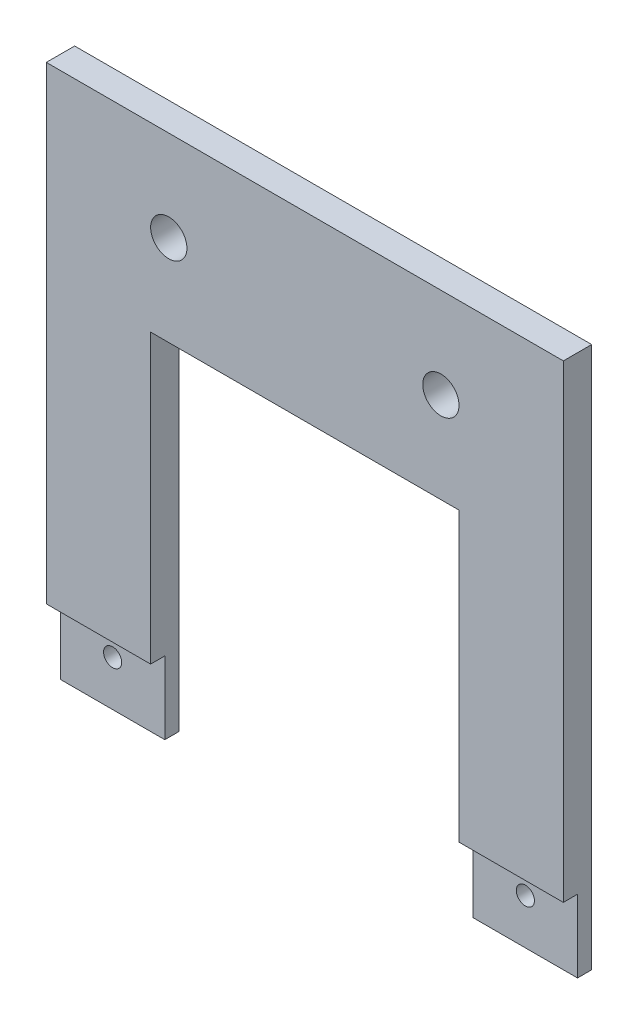
ISO-10303-21;
HEADER;
FILE_DESCRIPTION(('STEP AP214'),'2;1');
FILE_NAME('part.step','',(''),(''),'','','');
FILE_SCHEMA(('AUTOMOTIVE_DESIGN { 1 0 10303 214 1 1 1 1 }'));
ENDSEC;
DATA;
#1=APPLICATION_CONTEXT('core data for automotive mechanical design processes');
#2=APPLICATION_PROTOCOL_DEFINITION('international standard','automotive_design',2000,#1);
#3=PRODUCT_CONTEXT('',#1,'mechanical');
#4=PRODUCT('Part','Part','',(#3));
#5=PRODUCT_RELATED_PRODUCT_CATEGORY('part','',(#4));
#6=PRODUCT_DEFINITION_FORMATION('','',#4);
#7=PRODUCT_DEFINITION_CONTEXT('part definition',#1,'design');
#8=PRODUCT_DEFINITION('design','',#6,#7);
#9=PRODUCT_DEFINITION_SHAPE('','',#8);
#10=(LENGTH_UNIT() NAMED_UNIT(*) SI_UNIT(.MILLI.,.METRE.));
#11=(NAMED_UNIT(*) PLANE_ANGLE_UNIT() SI_UNIT($,.RADIAN.));
#12=(NAMED_UNIT(*) SI_UNIT($,.STERADIAN.) SOLID_ANGLE_UNIT());
#13=UNCERTAINTY_MEASURE_WITH_UNIT(LENGTH_MEASURE(1.E-05),#10,'distance_accuracy_value','');
#14=(GEOMETRIC_REPRESENTATION_CONTEXT(3) GLOBAL_UNCERTAINTY_ASSIGNED_CONTEXT((#13)) GLOBAL_UNIT_ASSIGNED_CONTEXT((#10,
#11,#12)) REPRESENTATION_CONTEXT('',''));
#15=CARTESIAN_POINT('',(0.,0.,0.));
#16=DIRECTION('',(0.,0.,1.));
#17=DIRECTION('',(1.,0.,0.));
#18=AXIS2_PLACEMENT_3D('',#15,#16,#17);
#19=CARTESIAN_POINT('',(0.,-19.85,0.781250025));
#20=DIRECTION('',(0.,-1.,0.));
#21=DIRECTION('',(1.,0.,0.));
#22=AXIS2_PLACEMENT_3D('',#19,#20,#21);
#23=PLANE('',#22);
#24=DIRECTION('',(0.,0.,-1.));
#25=VECTOR('',#24,1.);
#26=CARTESIAN_POINT('',(14.25,-19.85,0.781250025));
#27=LINE('',#26,#25);
#28=CARTESIAN_POINT('',(14.25,-19.85,0.));
#29=VERTEX_POINT('',#28);
#30=CARTESIAN_POINT('',(14.25,-19.85,-0.781250025));
#31=VERTEX_POINT('',#30);
#32=EDGE_CURVE('E43',#29,#31,#27,.T.);
#33=ORIENTED_EDGE('',*,*,#32,.F.);
#34=DIRECTION('',(1.,0.,0.));
#35=VECTOR('',#34,1.);
#36=CARTESIAN_POINT('',(0.,-19.85,0.));
#37=LINE('',#36,#35);
#38=CARTESIAN_POINT('',(8.49999999999999,-19.85,0.));
#39=VERTEX_POINT('',#38);
#40=EDGE_CURVE('E167',#39,#29,#37,.T.);
#41=ORIENTED_EDGE('',*,*,#40,.F.);
#42=DIRECTION('',(0.,0.,-1.));
#43=VECTOR('',#42,1.);
#44=CARTESIAN_POINT('',(8.49999999999999,-19.85,0.781250025));
#45=LINE('',#44,#43);
#46=CARTESIAN_POINT('',(8.49999999999999,-19.85,-0.781250025));
#47=VERTEX_POINT('',#46);
#48=EDGE_CURVE('E11',#39,#47,#45,.T.);
#49=ORIENTED_EDGE('',*,*,#48,.T.);
#50=DIRECTION('',(-1.,0.,0.));
#51=VECTOR('',#50,1.);
#52=CARTESIAN_POINT('',(0.,-19.85,-0.781250025));
#53=LINE('',#52,#51);
#54=EDGE_CURVE('E203',#31,#47,#53,.T.);
#55=ORIENTED_EDGE('',*,*,#54,.F.);
#56=EDGE_LOOP('',(#33,#41,#49,#55));
#57=FACE_BOUND('',#56,.T.);
#58=ADVANCED_FACE('F35',(#57),#23,.T.);
#59=CARTESIAN_POINT('',(-14.25,0.,0.781250025));
#60=DIRECTION('',(-1.,0.,0.));
#61=DIRECTION('',(0.,0.,1.));
#62=AXIS2_PLACEMENT_3D('',#59,#60,#61);
#63=PLANE('',#62);
#64=DIRECTION('',(0.,-1.,0.));
#65=VECTOR('',#64,1.);
#66=CARTESIAN_POINT('',(-14.25,0.,0.));
#67=LINE('',#66,#65);
#68=CARTESIAN_POINT('',(-14.25,-15.85,0.));
#69=VERTEX_POINT('',#68);
#70=CARTESIAN_POINT('',(-14.25,-19.85,0.));
#71=VERTEX_POINT('',#70);
#72=EDGE_CURVE('E135',#69,#71,#67,.T.);
#73=ORIENTED_EDGE('',*,*,#72,.F.);
#74=DIRECTION('',(0.,0.,1.));
#75=VECTOR('',#74,1.);
#76=CARTESIAN_POINT('',(-14.25,-15.85,0.));
#77=LINE('',#76,#75);
#78=CARTESIAN_POINT('',(-14.25,-15.85,0.781250025));
#79=VERTEX_POINT('',#78);
#80=EDGE_CURVE('E121',#69,#79,#77,.T.);
#81=ORIENTED_EDGE('',*,*,#80,.T.);
#82=DIRECTION('',(0.,1.,0.));
#83=VECTOR('',#82,1.);
#84=CARTESIAN_POINT('',(-14.25,0.,0.781250025));
#85=LINE('',#84,#83);
#86=CARTESIAN_POINT('',(-14.25,10.,0.781250025));
#87=VERTEX_POINT('',#86);
#88=EDGE_CURVE('E187',#79,#87,#85,.T.);
#89=ORIENTED_EDGE('',*,*,#88,.T.);
#90=DIRECTION('',(0.,0.,-1.));
#91=VECTOR('',#90,1.);
#92=CARTESIAN_POINT('',(-14.25,10.,0.781250025));
#93=LINE('',#92,#91);
#94=CARTESIAN_POINT('',(-14.25,10.,-0.781250025));
#95=VERTEX_POINT('',#94);
#96=EDGE_CURVE('E236',#87,#95,#93,.T.);
#97=ORIENTED_EDGE('',*,*,#96,.T.);
#98=DIRECTION('',(0.,1.,0.));
#99=VECTOR('',#98,1.);
#100=CARTESIAN_POINT('',(-14.25,0.,-0.781250025));
#101=LINE('',#100,#99);
#102=CARTESIAN_POINT('',(-14.25,-19.85,-0.781250025));
#103=VERTEX_POINT('',#102);
#104=EDGE_CURVE('E212',#103,#95,#101,.T.);
#105=ORIENTED_EDGE('',*,*,#104,.F.);
#106=DIRECTION('',(0.,0.,-1.));
#107=VECTOR('',#106,1.);
#108=CARTESIAN_POINT('',(-14.25,-19.85,0.781250025));
#109=LINE('',#108,#107);
#110=EDGE_CURVE('E143',#71,#103,#109,.T.);
#111=ORIENTED_EDGE('',*,*,#110,.F.);
#112=EDGE_LOOP('',(#73,#81,#89,#97,#105,#111));
#113=FACE_BOUND('',#112,.T.);
#114=ADVANCED_FACE('F141',(#113),#63,.T.);
#115=CARTESIAN_POINT('',(0.,-19.85,0.781250025));
#116=DIRECTION('',(0.,1.,0.));
#117=DIRECTION('',(-1.,0.,0.));
#118=AXIS2_PLACEMENT_3D('',#115,#116,#117);
#119=PLANE('',#118);
#120=DIRECTION('',(1.,0.,0.));
#121=VECTOR('',#120,1.);
#122=CARTESIAN_POINT('',(0.,-19.85,0.));
#123=LINE('',#122,#121);
#124=CARTESIAN_POINT('',(-8.5,-19.85,0.));
#125=VERTEX_POINT('',#124);
#126=EDGE_CURVE('E144',#71,#125,#123,.T.);
#127=ORIENTED_EDGE('',*,*,#126,.F.);
#128=ORIENTED_EDGE('',*,*,#110,.T.);
#129=DIRECTION('',(1.,0.,0.));
#130=VECTOR('',#129,1.);
#131=CARTESIAN_POINT('',(0.,-19.85,-0.781250025));
#132=LINE('',#131,#130);
#133=CARTESIAN_POINT('',(-8.5,-19.85,-0.781250025));
#134=VERTEX_POINT('',#133);
#135=EDGE_CURVE('E215',#103,#134,#132,.T.);
#136=ORIENTED_EDGE('',*,*,#135,.T.);
#137=DIRECTION('',(0.,0.,-1.));
#138=VECTOR('',#137,1.);
#139=CARTESIAN_POINT('',(-8.5,-19.85,0.781250025));
#140=LINE('',#139,#138);
#141=EDGE_CURVE('E233',#125,#134,#140,.T.);
#142=ORIENTED_EDGE('',*,*,#141,.F.);
#143=EDGE_LOOP('',(#127,#128,#136,#142));
#144=FACE_BOUND('',#143,.T.);
#145=ADVANCED_FACE('F270',(#144),#119,.F.);
#146=CARTESIAN_POINT('',(-8.5,0.,0.781250025));
#147=DIRECTION('',(-1.,0.,0.));
#148=DIRECTION('',(0.,0.,1.));
#149=AXIS2_PLACEMENT_3D('',#146,#147,#148);
#150=PLANE('',#149);
#151=DIRECTION('',(0.,0.,1.));
#152=VECTOR('',#151,1.);
#153=CARTESIAN_POINT('',(-8.5,-15.85,0.));
#154=LINE('',#153,#152);
#155=CARTESIAN_POINT('',(-8.5,-15.85,0.));
#156=VERTEX_POINT('',#155);
#157=CARTESIAN_POINT('',(-8.5,-15.85,0.781250025));
#158=VERTEX_POINT('',#157);
#159=EDGE_CURVE('E50',#156,#158,#154,.T.);
#160=ORIENTED_EDGE('',*,*,#159,.F.);
#161=DIRECTION('',(0.,1.,0.));
#162=VECTOR('',#161,1.);
#163=CARTESIAN_POINT('',(-8.5,0.,0.));
#164=LINE('',#163,#162);
#165=EDGE_CURVE('E138',#125,#156,#164,.T.);
#166=ORIENTED_EDGE('',*,*,#165,.F.);
#167=ORIENTED_EDGE('',*,*,#141,.T.);
#168=DIRECTION('',(0.,1.,0.));
#169=VECTOR('',#168,1.);
#170=CARTESIAN_POINT('',(-8.5,0.,-0.781250025));
#171=LINE('',#170,#169);
#172=CARTESIAN_POINT('',(-8.5,0.,-0.781250025));
#173=VERTEX_POINT('',#172);
#174=EDGE_CURVE('E218',#134,#173,#171,.T.);
#175=ORIENTED_EDGE('',*,*,#174,.T.);
#176=DIRECTION('',(0.,0.,-1.));
#177=VECTOR('',#176,1.);
#178=CARTESIAN_POINT('',(-8.5,0.,0.781250025));
#179=LINE('',#178,#177);
#180=CARTESIAN_POINT('',(-8.5,0.,0.781250025));
#181=VERTEX_POINT('',#180);
#182=EDGE_CURVE('E230',#181,#173,#179,.T.);
#183=ORIENTED_EDGE('',*,*,#182,.F.);
#184=DIRECTION('',(0.,1.,0.));
#185=VECTOR('',#184,1.);
#186=CARTESIAN_POINT('',(-8.5,0.,0.781250025));
#187=LINE('',#186,#185);
#188=EDGE_CURVE('E189',#158,#181,#187,.T.);
#189=ORIENTED_EDGE('',*,*,#188,.F.);
#190=EDGE_LOOP('',(#160,#166,#167,#175,#183,#189));
#191=FACE_BOUND('',#190,.T.);
#192=ADVANCED_FACE('F267',(#191),#150,.F.);
#193=CARTESIAN_POINT('',(11.375,-17.35,0.781250025));
#194=DIRECTION('',(0.,0.,-1.));
#195=DIRECTION('',(-1.,0.,0.));
#196=AXIS2_PLACEMENT_3D('',#193,#194,#195);
#197=CYLINDRICAL_SURFACE('',#196,0.500000000000001);
#198=CARTESIAN_POINT('',(11.375,-17.35,-0.781250025));
#199=DIRECTION('',(0.,0.,1.));
#200=DIRECTION('',(1.,0.,0.));
#201=AXIS2_PLACEMENT_3D('',#198,#199,#200);
#202=CIRCLE('',#201,0.500000000000001);
#203=CARTESIAN_POINT('',(11.875,-17.35,-0.781250025));
#204=VERTEX_POINT('',#203);
#205=EDGE_CURVE('E224',#204,#204,#202,.F.);
#206=ORIENTED_EDGE('',*,*,#205,.T.);
#207=EDGE_LOOP('',(#206));
#208=FACE_BOUND('',#207,.T.);
#209=CARTESIAN_POINT('',(11.375,-17.35,0.));
#210=DIRECTION('',(0.,0.,1.));
#211=DIRECTION('',(1.,0.,0.));
#212=AXIS2_PLACEMENT_3D('',#209,#210,#211);
#213=CIRCLE('',#212,0.500000000000001);
#214=CARTESIAN_POINT('',(11.875,-17.35,0.));
#215=VERTEX_POINT('',#214);
#216=EDGE_CURVE('E155',#215,#215,#213,.F.);
#217=ORIENTED_EDGE('',*,*,#216,.F.);
#218=EDGE_LOOP('',(#217));
#219=FACE_BOUND('',#218,.T.);
#220=ADVANCED_FACE('F323',(#208,#219),#197,.F.);
#221=CARTESIAN_POINT('',(-11.375,-17.35,0.781250025));
#222=DIRECTION('',(0.,0.,-1.));
#223=DIRECTION('',(-1.,0.,0.));
#224=AXIS2_PLACEMENT_3D('',#221,#222,#223);
#225=CYLINDRICAL_SURFACE('',#224,0.500000000000001);
#226=CARTESIAN_POINT('',(-11.375,-17.35,-0.781250025));
#227=DIRECTION('',(0.,0.,1.));
#228=DIRECTION('',(1.,0.,0.));
#229=AXIS2_PLACEMENT_3D('',#226,#227,#228);
#230=CIRCLE('',#229,0.500000000000001);
#231=CARTESIAN_POINT('',(-10.875,-17.35,-0.781250025));
#232=VERTEX_POINT('',#231);
#233=EDGE_CURVE('E177',#232,#232,#230,.T.);
#234=ORIENTED_EDGE('',*,*,#233,.F.);
#235=EDGE_LOOP('',(#234));
#236=FACE_BOUND('',#235,.T.);
#237=CARTESIAN_POINT('',(-11.375,-17.35,0.));
#238=DIRECTION('',(0.,0.,1.));
#239=DIRECTION('',(1.,0.,0.));
#240=AXIS2_PLACEMENT_3D('',#237,#238,#239);
#241=CIRCLE('',#240,0.500000000000001);
#242=CARTESIAN_POINT('',(-10.875,-17.35,0.));
#243=VERTEX_POINT('',#242);
#244=EDGE_CURVE('E130',#243,#243,#241,.F.);
#245=ORIENTED_EDGE('',*,*,#244,.F.);
#246=EDGE_LOOP('',(#245));
#247=FACE_BOUND('',#246,.T.);
#248=ADVANCED_FACE('F320',(#236,#247),#225,.F.);
#249=CARTESIAN_POINT('',(0.,0.,0.781250025));
#250=DIRECTION('',(0.,0.,1.));
#251=DIRECTION('',(1.,0.,0.));
#252=AXIS2_PLACEMENT_3D('',#249,#250,#251);
#253=PLANE('',#252);
#254=CARTESIAN_POINT('',(7.50000000000001,5.00000000000001,0.781250025));
#255=DIRECTION('',(0.,0.,1.));
#256=DIRECTION('',(1.,0.,0.));
#257=AXIS2_PLACEMENT_3D('',#254,#255,#256);
#258=CIRCLE('',#257,1.);
#259=CARTESIAN_POINT('',(8.50000000000001,5.00000000000001,0.781250025));
#260=VERTEX_POINT('',#259);
#261=EDGE_CURVE('E176',#260,#260,#258,.F.);
#262=ORIENTED_EDGE('',*,*,#261,.T.);
#263=EDGE_LOOP('',(#262));
#264=FACE_BOUND('',#263,.T.);
#265=CARTESIAN_POINT('',(-7.50000000000001,5.00000000000001,0.781250025));
#266=DIRECTION('',(0.,0.,1.));
#267=DIRECTION('',(1.,0.,0.));
#268=AXIS2_PLACEMENT_3D('',#265,#266,#267);
#269=CIRCLE('',#268,1.);
#270=CARTESIAN_POINT('',(-6.50000000000001,5.00000000000001,0.781250025));
#271=VERTEX_POINT('',#270);
#272=EDGE_CURVE('E173',#271,#271,#269,.T.);
#273=ORIENTED_EDGE('',*,*,#272,.F.);
#274=EDGE_LOOP('',(#273));
#275=FACE_BOUND('',#274,.T.);
#276=ORIENTED_EDGE('',*,*,#88,.F.);
#277=DIRECTION('',(1.,0.,0.));
#278=VECTOR('',#277,1.);
#279=CARTESIAN_POINT('',(0.,-15.85,0.781250025));
#280=LINE('',#279,#278);
#281=EDGE_CURVE('E126',#79,#158,#280,.T.);
#282=ORIENTED_EDGE('',*,*,#281,.T.);
#283=ORIENTED_EDGE('',*,*,#188,.T.);
#284=DIRECTION('',(1.,0.,0.));
#285=VECTOR('',#284,1.);
#286=CARTESIAN_POINT('',(0.,0.,0.781250025));
#287=LINE('',#286,#285);
#288=CARTESIAN_POINT('',(8.5,0.,0.781250025));
#289=VERTEX_POINT('',#288);
#290=EDGE_CURVE('E191',#181,#289,#287,.T.);
#291=ORIENTED_EDGE('',*,*,#290,.T.);
#292=DIRECTION('',(0.,1.,0.));
#293=VECTOR('',#292,1.);
#294=CARTESIAN_POINT('',(8.5,0.,0.781250025));
#295=LINE('',#294,#293);
#296=CARTESIAN_POINT('',(8.49999999999999,-15.85,0.781250025));
#297=VERTEX_POINT('',#296);
#298=EDGE_CURVE('E180',#297,#289,#295,.T.);
#299=ORIENTED_EDGE('',*,*,#298,.F.);
#300=DIRECTION('',(-1.,0.,0.));
#301=VECTOR('',#300,1.);
#302=CARTESIAN_POINT('',(0.,-15.85,0.781250025));
#303=LINE('',#302,#301);
#304=CARTESIAN_POINT('',(14.25,-15.85,0.781250025));
#305=VERTEX_POINT('',#304);
#306=EDGE_CURVE('E159',#305,#297,#303,.T.);
#307=ORIENTED_EDGE('',*,*,#306,.F.);
#308=DIRECTION('',(0.,1.,0.));
#309=VECTOR('',#308,1.);
#310=CARTESIAN_POINT('',(14.25,0.,0.781250025));
#311=LINE('',#310,#309);
#312=CARTESIAN_POINT('',(14.25,9.99999999999999,0.781250025));
#313=VERTEX_POINT('',#312);
#314=EDGE_CURVE('E182',#305,#313,#311,.T.);
#315=ORIENTED_EDGE('',*,*,#314,.T.);
#316=DIRECTION('',(-1.,0.,0.));
#317=VECTOR('',#316,1.);
#318=CARTESIAN_POINT('',(0.,10.,0.781250025));
#319=LINE('',#318,#317);
#320=EDGE_CURVE('E184',#313,#87,#319,.T.);
#321=ORIENTED_EDGE('',*,*,#320,.T.);
#322=EDGE_LOOP('',(#276,#282,#283,#291,#299,#307,#315,#321));
#323=FACE_BOUND('',#322,.T.);
#324=ADVANCED_FACE('F276',(#264,#275,#323),#253,.T.);
#325=CARTESIAN_POINT('',(8.5,0.,0.781250025));
#326=DIRECTION('',(-1.,0.,0.));
#327=DIRECTION('',(0.,-1.,0.));
#328=AXIS2_PLACEMENT_3D('',#325,#326,#327);
#329=PLANE('',#328);
#330=DIRECTION('',(0.,0.,1.));
#331=VECTOR('',#330,1.);
#332=CARTESIAN_POINT('',(8.49999999999999,-15.85,0.));
#333=LINE('',#332,#331);
#334=CARTESIAN_POINT('',(8.49999999999999,-15.85,0.));
#335=VERTEX_POINT('',#334);
#336=EDGE_CURVE('E152',#335,#297,#333,.T.);
#337=ORIENTED_EDGE('',*,*,#336,.T.);
#338=ORIENTED_EDGE('',*,*,#298,.T.);
#339=DIRECTION('',(0.,0.,-1.));
#340=VECTOR('',#339,1.);
#341=CARTESIAN_POINT('',(8.5,0.,0.781250025));
#342=LINE('',#341,#340);
#343=CARTESIAN_POINT('',(8.5,0.,-0.781250025));
#344=VERTEX_POINT('',#343);
#345=EDGE_CURVE('E194',#289,#344,#342,.T.);
#346=ORIENTED_EDGE('',*,*,#345,.T.);
#347=DIRECTION('',(0.,1.,0.));
#348=VECTOR('',#347,1.);
#349=CARTESIAN_POINT('',(8.5,0.,-0.781250025));
#350=LINE('',#349,#348);
#351=EDGE_CURVE('E200',#47,#344,#350,.T.);
#352=ORIENTED_EDGE('',*,*,#351,.F.);
#353=ORIENTED_EDGE('',*,*,#48,.F.);
#354=DIRECTION('',(0.,-1.,0.));
#355=VECTOR('',#354,1.);
#356=CARTESIAN_POINT('',(8.5,0.,0.));
#357=LINE('',#356,#355);
#358=EDGE_CURVE('E165',#335,#39,#357,.T.);
#359=ORIENTED_EDGE('',*,*,#358,.F.);
#360=EDGE_LOOP('',(#337,#338,#346,#352,#353,#359));
#361=FACE_BOUND('',#360,.T.);
#362=ADVANCED_FACE('F257',(#361),#329,.T.);
#363=CARTESIAN_POINT('',(14.25,0.,0.781250025));
#364=DIRECTION('',(-1.,0.,0.));
#365=DIRECTION('',(0.,-1.,0.));
#366=AXIS2_PLACEMENT_3D('',#363,#364,#365);
#367=PLANE('',#366);
#368=ORIENTED_EDGE('',*,*,#314,.F.);
#369=DIRECTION('',(0.,0.,1.));
#370=VECTOR('',#369,1.);
#371=CARTESIAN_POINT('',(14.25,-15.85,0.));
#372=LINE('',#371,#370);
#373=CARTESIAN_POINT('',(14.25,-15.85,0.));
#374=VERTEX_POINT('',#373);
#375=EDGE_CURVE('E58',#374,#305,#372,.T.);
#376=ORIENTED_EDGE('',*,*,#375,.F.);
#377=DIRECTION('',(0.,1.,0.));
#378=VECTOR('',#377,1.);
#379=CARTESIAN_POINT('',(14.25,0.,0.));
#380=LINE('',#379,#378);
#381=EDGE_CURVE('E158',#29,#374,#380,.T.);
#382=ORIENTED_EDGE('',*,*,#381,.F.);
#383=ORIENTED_EDGE('',*,*,#32,.T.);
#384=DIRECTION('',(0.,1.,0.));
#385=VECTOR('',#384,1.);
#386=CARTESIAN_POINT('',(14.25,0.,-0.781250025));
#387=LINE('',#386,#385);
#388=CARTESIAN_POINT('',(14.25,9.99999999999999,-0.781250025));
#389=VERTEX_POINT('',#388);
#390=EDGE_CURVE('E206',#31,#389,#387,.T.);
#391=ORIENTED_EDGE('',*,*,#390,.T.);
#392=DIRECTION('',(0.,0.,-1.));
#393=VECTOR('',#392,1.);
#394=CARTESIAN_POINT('',(14.25,9.99999999999999,0.781250025));
#395=LINE('',#394,#393);
#396=EDGE_CURVE('E238',#313,#389,#395,.T.);
#397=ORIENTED_EDGE('',*,*,#396,.F.);
#398=EDGE_LOOP('',(#368,#376,#382,#383,#391,#397));
#399=FACE_BOUND('',#398,.T.);
#400=ADVANCED_FACE('F245',(#399),#367,.F.);
#401=CARTESIAN_POINT('',(0.,10.,0.781250025));
#402=DIRECTION('',(0.,-1.,0.));
#403=DIRECTION('',(1.,0.,0.));
#404=AXIS2_PLACEMENT_3D('',#401,#402,#403);
#405=PLANE('',#404);
#406=DIRECTION('',(-1.,0.,0.));
#407=VECTOR('',#406,1.);
#408=CARTESIAN_POINT('',(0.,10.,-0.781250025));
#409=LINE('',#408,#407);
#410=EDGE_CURVE('E209',#389,#95,#409,.T.);
#411=ORIENTED_EDGE('',*,*,#410,.T.);
#412=ORIENTED_EDGE('',*,*,#96,.F.);
#413=ORIENTED_EDGE('',*,*,#320,.F.);
#414=ORIENTED_EDGE('',*,*,#396,.T.);
#415=EDGE_LOOP('',(#411,#412,#413,#414));
#416=FACE_BOUND('',#415,.T.);
#417=ADVANCED_FACE('F274',(#416),#405,.F.);
#418=CARTESIAN_POINT('',(0.,0.,0.781250025));
#419=DIRECTION('',(0.,1.,0.));
#420=DIRECTION('',(0.,0.,1.));
#421=AXIS2_PLACEMENT_3D('',#418,#419,#420);
#422=PLANE('',#421);
#423=DIRECTION('',(1.,0.,0.));
#424=VECTOR('',#423,1.);
#425=CARTESIAN_POINT('',(0.,0.,-0.781250025));
#426=LINE('',#425,#424);
#427=EDGE_CURVE('E221',#173,#344,#426,.T.);
#428=ORIENTED_EDGE('',*,*,#427,.T.);
#429=ORIENTED_EDGE('',*,*,#345,.F.);
#430=ORIENTED_EDGE('',*,*,#290,.F.);
#431=ORIENTED_EDGE('',*,*,#182,.T.);
#432=EDGE_LOOP('',(#428,#429,#430,#431));
#433=FACE_BOUND('',#432,.T.);
#434=ADVANCED_FACE('F264',(#433),#422,.F.);
#435=CARTESIAN_POINT('',(7.50000000000001,5.00000000000001,0.781250025));
#436=DIRECTION('',(0.,0.,-1.));
#437=DIRECTION('',(-1.,0.,0.));
#438=AXIS2_PLACEMENT_3D('',#435,#436,#437);
#439=CYLINDRICAL_SURFACE('',#438,1.);
#440=ORIENTED_EDGE('',*,*,#261,.F.);
#441=EDGE_LOOP('',(#440));
#442=FACE_BOUND('',#441,.T.);
#443=CARTESIAN_POINT('',(7.50000000000001,5.00000000000001,-0.781250025));
#444=DIRECTION('',(0.,0.,1.));
#445=DIRECTION('',(1.,0.,0.));
#446=AXIS2_PLACEMENT_3D('',#443,#444,#445);
#447=CIRCLE('',#446,1.);
#448=CARTESIAN_POINT('',(8.50000000000001,5.00000000000001,-0.781250025));
#449=VERTEX_POINT('',#448);
#450=EDGE_CURVE('E197',#449,#449,#447,.F.);
#451=ORIENTED_EDGE('',*,*,#450,.T.);
#452=EDGE_LOOP('',(#451));
#453=FACE_BOUND('',#452,.T.);
#454=ADVANCED_FACE('F300',(#442,#453),#439,.F.);
#455=CARTESIAN_POINT('',(-7.50000000000001,5.00000000000001,0.781250025));
#456=DIRECTION('',(0.,0.,-1.));
#457=DIRECTION('',(-1.,0.,0.));
#458=AXIS2_PLACEMENT_3D('',#455,#456,#457);
#459=CYLINDRICAL_SURFACE('',#458,1.);
#460=ORIENTED_EDGE('',*,*,#272,.T.);
#461=EDGE_LOOP('',(#460));
#462=FACE_BOUND('',#461,.T.);
#463=CARTESIAN_POINT('',(-7.50000000000001,5.00000000000001,-0.781250025));
#464=DIRECTION('',(0.,0.,1.));
#465=DIRECTION('',(1.,0.,0.));
#466=AXIS2_PLACEMENT_3D('',#463,#464,#465);
#467=CIRCLE('',#466,1.);
#468=CARTESIAN_POINT('',(-6.50000000000001,5.00000000000001,-0.781250025));
#469=VERTEX_POINT('',#468);
#470=EDGE_CURVE('E153',#469,#469,#467,.T.);
#471=ORIENTED_EDGE('',*,*,#470,.F.);
#472=EDGE_LOOP('',(#471));
#473=FACE_BOUND('',#472,.T.);
#474=ADVANCED_FACE('F37',(#462,#473),#459,.F.);
#475=CARTESIAN_POINT('',(0.,0.,-0.781250025));
#476=DIRECTION('',(0.,0.,1.));
#477=DIRECTION('',(1.,0.,0.));
#478=AXIS2_PLACEMENT_3D('',#475,#476,#477);
#479=PLANE('',#478);
#480=ORIENTED_EDGE('',*,*,#470,.T.);
#481=EDGE_LOOP('',(#480));
#482=FACE_BOUND('',#481,.T.);
#483=ORIENTED_EDGE('',*,*,#450,.F.);
#484=EDGE_LOOP('',(#483));
#485=FACE_BOUND('',#484,.T.);
#486=ORIENTED_EDGE('',*,*,#351,.T.);
#487=ORIENTED_EDGE('',*,*,#427,.F.);
#488=ORIENTED_EDGE('',*,*,#174,.F.);
#489=ORIENTED_EDGE('',*,*,#135,.F.);
#490=ORIENTED_EDGE('',*,*,#104,.T.);
#491=ORIENTED_EDGE('',*,*,#410,.F.);
#492=ORIENTED_EDGE('',*,*,#390,.F.);
#493=ORIENTED_EDGE('',*,*,#54,.T.);
#494=EDGE_LOOP('',(#486,#487,#488,#489,#490,#491,#492,#493));
#495=FACE_BOUND('',#494,.T.);
#496=ORIENTED_EDGE('',*,*,#205,.F.);
#497=EDGE_LOOP('',(#496));
#498=FACE_BOUND('',#497,.T.);
#499=ORIENTED_EDGE('',*,*,#233,.T.);
#500=EDGE_LOOP('',(#499));
#501=FACE_BOUND('',#500,.T.);
#502=ADVANCED_FACE('F251',(#482,#485,#495,#498,#501),#479,.F.);
#503=CARTESIAN_POINT('',(0.,-15.85,0.));
#504=DIRECTION('',(0.,1.,0.));
#505=DIRECTION('',(0.,0.,1.));
#506=AXIS2_PLACEMENT_3D('',#503,#504,#505);
#507=PLANE('',#506);
#508=ORIENTED_EDGE('',*,*,#306,.T.);
#509=ORIENTED_EDGE('',*,*,#336,.F.);
#510=DIRECTION('',(-1.,0.,0.));
#511=VECTOR('',#510,1.);
#512=CARTESIAN_POINT('',(0.,-15.85,0.));
#513=LINE('',#512,#511);
#514=EDGE_CURVE('E162',#374,#335,#513,.T.);
#515=ORIENTED_EDGE('',*,*,#514,.F.);
#516=ORIENTED_EDGE('',*,*,#375,.T.);
#517=EDGE_LOOP('',(#508,#509,#515,#516));
#518=FACE_BOUND('',#517,.T.);
#519=ADVANCED_FACE('F278',(#518),#507,.F.);
#520=CARTESIAN_POINT('',(0.,0.,0.));
#521=DIRECTION('',(0.,0.,1.));
#522=DIRECTION('',(1.,0.,0.));
#523=AXIS2_PLACEMENT_3D('',#520,#521,#522);
#524=PLANE('',#523);
#525=ORIENTED_EDGE('',*,*,#216,.T.);
#526=EDGE_LOOP('',(#525));
#527=FACE_BOUND('',#526,.T.);
#528=ORIENTED_EDGE('',*,*,#381,.T.);
#529=ORIENTED_EDGE('',*,*,#514,.T.);
#530=ORIENTED_EDGE('',*,*,#358,.T.);
#531=ORIENTED_EDGE('',*,*,#40,.T.);
#532=EDGE_LOOP('',(#528,#529,#530,#531));
#533=FACE_BOUND('',#532,.T.);
#534=ADVANCED_FACE('F280',(#527,#533),#524,.T.);
#535=CARTESIAN_POINT('',(0.,-15.85,0.));
#536=DIRECTION('',(0.,-1.,0.));
#537=DIRECTION('',(0.,0.,-1.));
#538=AXIS2_PLACEMENT_3D('',#535,#536,#537);
#539=PLANE('',#538);
#540=ORIENTED_EDGE('',*,*,#281,.F.);
#541=ORIENTED_EDGE('',*,*,#80,.F.);
#542=DIRECTION('',(1.,0.,0.));
#543=VECTOR('',#542,1.);
#544=CARTESIAN_POINT('',(0.,-15.85,0.));
#545=LINE('',#544,#543);
#546=EDGE_CURVE('E124',#69,#156,#545,.T.);
#547=ORIENTED_EDGE('',*,*,#546,.T.);
#548=ORIENTED_EDGE('',*,*,#159,.T.);
#549=EDGE_LOOP('',(#540,#541,#547,#548));
#550=FACE_BOUND('',#549,.T.);
#551=ADVANCED_FACE('F123',(#550),#539,.T.);
#552=CARTESIAN_POINT('',(0.,0.,0.));
#553=DIRECTION('',(0.,0.,1.));
#554=DIRECTION('',(1.,0.,0.));
#555=AXIS2_PLACEMENT_3D('',#552,#553,#554);
#556=PLANE('',#555);
#557=ORIENTED_EDGE('',*,*,#546,.F.);
#558=ORIENTED_EDGE('',*,*,#72,.T.);
#559=ORIENTED_EDGE('',*,*,#126,.T.);
#560=ORIENTED_EDGE('',*,*,#165,.T.);
#561=EDGE_LOOP('',(#557,#558,#559,#560));
#562=FACE_BOUND('',#561,.T.);
#563=ORIENTED_EDGE('',*,*,#244,.T.);
#564=EDGE_LOOP('',(#563));
#565=FACE_BOUND('',#564,.T.);
#566=ADVANCED_FACE('F133',(#562,#565),#556,.T.);
#567=CLOSED_SHELL('',(#58,#114,#145,#192,#220,#248,#324,#362,#400,#417,#434,#454,#474,#502,#519,
#534,#551,#566));
#568=MANIFOLD_SOLID_BREP('B2',#567);
#569=ADVANCED_BREP_SHAPE_REPRESENTATION('',(#18,#568),#14);
#570=SHAPE_DEFINITION_REPRESENTATION(#9,#569);
ENDSEC;
END-ISO-10303-21;
